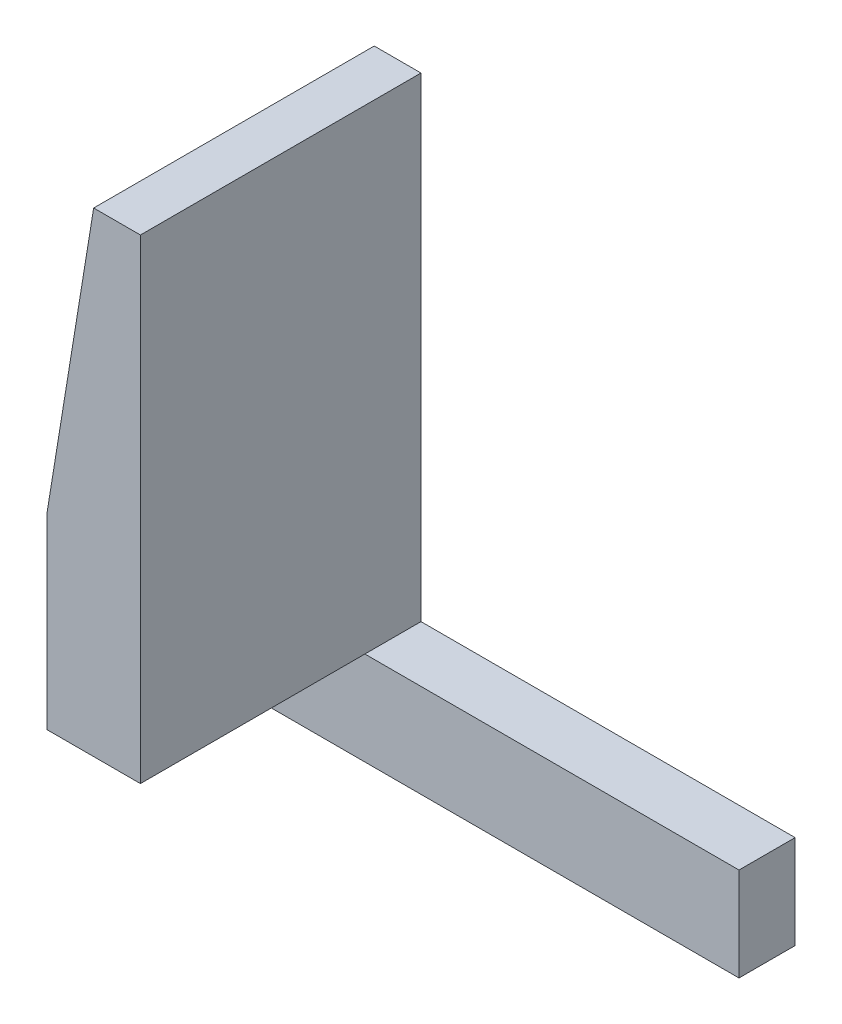
ISO-10303-21;
HEADER;
FILE_DESCRIPTION(('STEP AP214'),'2;1');
FILE_NAME('part.step','',(''),(''),'','','');
FILE_SCHEMA(('AUTOMOTIVE_DESIGN { 1 0 10303 214 1 1 1 1 }'));
ENDSEC;
DATA;
#1=APPLICATION_CONTEXT('core data for automotive mechanical design processes');
#2=APPLICATION_PROTOCOL_DEFINITION('international standard','automotive_design',2000,#1);
#3=PRODUCT_CONTEXT('',#1,'mechanical');
#4=PRODUCT('Part','Part','',(#3));
#5=PRODUCT_RELATED_PRODUCT_CATEGORY('part','',(#4));
#6=PRODUCT_DEFINITION_FORMATION('','',#4);
#7=PRODUCT_DEFINITION_CONTEXT('part definition',#1,'design');
#8=PRODUCT_DEFINITION('design','',#6,#7);
#9=PRODUCT_DEFINITION_SHAPE('','',#8);
#10=(LENGTH_UNIT() NAMED_UNIT(*) SI_UNIT(.MILLI.,.METRE.));
#11=(NAMED_UNIT(*) PLANE_ANGLE_UNIT() SI_UNIT($,.RADIAN.));
#12=(NAMED_UNIT(*) SI_UNIT($,.STERADIAN.) SOLID_ANGLE_UNIT());
#13=UNCERTAINTY_MEASURE_WITH_UNIT(LENGTH_MEASURE(1.E-05),#10,'distance_accuracy_value','');
#14=(GEOMETRIC_REPRESENTATION_CONTEXT(3) GLOBAL_UNCERTAINTY_ASSIGNED_CONTEXT((#13)) GLOBAL_UNIT_ASSIGNED_CONTEXT((#10,
#11,#12)) REPRESENTATION_CONTEXT('',''));
#15=CARTESIAN_POINT('',(0.,0.,0.));
#16=DIRECTION('',(0.,0.,1.));
#17=DIRECTION('',(1.,0.,0.));
#18=AXIS2_PLACEMENT_3D('',#15,#16,#17);
#19=CARTESIAN_POINT('',(-5.,0.,15.));
#20=DIRECTION('',(0.,1.,0.));
#21=DIRECTION('',(0.,0.,1.));
#22=AXIS2_PLACEMENT_3D('',#19,#20,#21);
#23=PLANE('',#22);
#24=DIRECTION('',(-1.,0.,0.));
#25=VECTOR('',#24,1.);
#26=CARTESIAN_POINT('',(-5.,0.,3.));
#27=LINE('',#26,#25);
#28=CARTESIAN_POINT('',(0.,0.,3.));
#29=VERTEX_POINT('',#28);
#30=CARTESIAN_POINT('',(-5.,0.,3.));
#31=VERTEX_POINT('',#30);
#32=EDGE_CURVE('E11',#29,#31,#27,.T.);
#33=ORIENTED_EDGE('',*,*,#32,.F.);
#34=DIRECTION('',(0.,0.,-1.));
#35=VECTOR('',#34,1.);
#36=CARTESIAN_POINT('',(0.,0.,15.));
#37=LINE('',#36,#35);
#38=CARTESIAN_POINT('',(0.,0.,15.));
#39=VERTEX_POINT('',#38);
#40=EDGE_CURVE('E42',#39,#29,#37,.T.);
#41=ORIENTED_EDGE('',*,*,#40,.F.);
#42=DIRECTION('',(1.,0.,0.));
#43=VECTOR('',#42,1.);
#44=CARTESIAN_POINT('',(-5.,0.,15.));
#45=LINE('',#44,#43);
#46=CARTESIAN_POINT('',(-5.,0.,15.));
#47=VERTEX_POINT('',#46);
#48=EDGE_CURVE('E137',#47,#39,#45,.T.);
#49=ORIENTED_EDGE('',*,*,#48,.F.);
#50=DIRECTION('',(0.,0.,-1.));
#51=VECTOR('',#50,1.);
#52=CARTESIAN_POINT('',(-5.,0.,15.));
#53=LINE('',#52,#51);
#54=EDGE_CURVE('E121',#47,#31,#53,.T.);
#55=ORIENTED_EDGE('',*,*,#54,.T.);
#56=EDGE_LOOP('',(#33,#41,#49,#55));
#57=FACE_BOUND('',#56,.T.);
#58=ADVANCED_FACE('F39',(#57),#23,.F.);
#59=CARTESIAN_POINT('',(0.,0.,15.));
#60=DIRECTION('',(-1.,0.,0.));
#61=DIRECTION('',(0.,0.,1.));
#62=AXIS2_PLACEMENT_3D('',#59,#60,#61);
#63=PLANE('',#62);
#64=DIRECTION('',(0.,1.,0.));
#65=VECTOR('',#64,1.);
#66=CARTESIAN_POINT('',(0.,0.,0.));
#67=LINE('',#66,#65);
#68=CARTESIAN_POINT('',(0.,0.,0.));
#69=VERTEX_POINT('',#68);
#70=CARTESIAN_POINT('',(0.,25.4,0.));
#71=VERTEX_POINT('',#70);
#72=EDGE_CURVE('E125',#69,#71,#67,.T.);
#73=ORIENTED_EDGE('',*,*,#72,.T.);
#74=DIRECTION('',(0.,0.,-1.));
#75=VECTOR('',#74,1.);
#76=CARTESIAN_POINT('',(0.,25.4,15.));
#77=LINE('',#76,#75);
#78=CARTESIAN_POINT('',(0.,25.4,15.));
#79=VERTEX_POINT('',#78);
#80=EDGE_CURVE('E114',#79,#71,#77,.T.);
#81=ORIENTED_EDGE('',*,*,#80,.F.);
#82=DIRECTION('',(0.,1.,0.));
#83=VECTOR('',#82,1.);
#84=CARTESIAN_POINT('',(0.,0.,15.));
#85=LINE('',#84,#83);
#86=EDGE_CURVE('E93',#39,#79,#85,.T.);
#87=ORIENTED_EDGE('',*,*,#86,.F.);
#88=ORIENTED_EDGE('',*,*,#40,.T.);
#89=EDGE_CURVE('E142',#29,#69,#37,.T.);
#90=ORIENTED_EDGE('',*,*,#89,.T.);
#91=EDGE_LOOP('',(#73,#81,#87,#88,#90));
#92=FACE_BOUND('',#91,.T.);
#93=ADVANCED_FACE('F147',(#92),#63,.F.);
#94=CARTESIAN_POINT('',(0.,25.4,15.));
#95=DIRECTION('',(0.,-1.,0.));
#96=DIRECTION('',(0.,0.,-1.));
#97=AXIS2_PLACEMENT_3D('',#94,#95,#96);
#98=PLANE('',#97);
#99=DIRECTION('',(-1.,0.,0.));
#100=VECTOR('',#99,1.);
#101=CARTESIAN_POINT('',(0.,25.4,0.));
#102=LINE('',#101,#100);
#103=CARTESIAN_POINT('',(-2.5,25.4,0.));
#104=VERTEX_POINT('',#103);
#105=EDGE_CURVE('E112',#71,#104,#102,.T.);
#106=ORIENTED_EDGE('',*,*,#105,.T.);
#107=DIRECTION('',(0.,0.,-1.));
#108=VECTOR('',#107,1.);
#109=CARTESIAN_POINT('',(-2.5,25.4,15.));
#110=LINE('',#109,#108);
#111=CARTESIAN_POINT('',(-2.5,25.4,15.));
#112=VERTEX_POINT('',#111);
#113=EDGE_CURVE('E109',#112,#104,#110,.T.);
#114=ORIENTED_EDGE('',*,*,#113,.F.);
#115=DIRECTION('',(-1.,0.,0.));
#116=VECTOR('',#115,1.);
#117=CARTESIAN_POINT('',(0.,25.4,15.));
#118=LINE('',#117,#116);
#119=EDGE_CURVE('E100',#79,#112,#118,.T.);
#120=ORIENTED_EDGE('',*,*,#119,.F.);
#121=ORIENTED_EDGE('',*,*,#80,.T.);
#122=EDGE_LOOP('',(#106,#114,#120,#121));
#123=FACE_BOUND('',#122,.T.);
#124=ADVANCED_FACE('F110',(#123),#98,.F.);
#125=CARTESIAN_POINT('',(-2.5,25.4,15.));
#126=DIRECTION('',(0.987078091367104,-0.160239949897257,0.));
#127=DIRECTION('',(0.160239949897257,0.987078091367104,0.));
#128=AXIS2_PLACEMENT_3D('',#125,#126,#127);
#129=PLANE('',#128);
#130=DIRECTION('',(-0.160239949897257,-0.987078091367104,0.));
#131=VECTOR('',#130,1.);
#132=CARTESIAN_POINT('',(-2.5,25.4,0.));
#133=LINE('',#132,#131);
#134=CARTESIAN_POINT('',(-5.,10.,0.));
#135=VERTEX_POINT('',#134);
#136=EDGE_CURVE('E85',#104,#135,#133,.T.);
#137=ORIENTED_EDGE('',*,*,#136,.T.);
#138=DIRECTION('',(0.,0.,-1.));
#139=VECTOR('',#138,1.);
#140=CARTESIAN_POINT('',(-5.,10.,15.));
#141=LINE('',#140,#139);
#142=CARTESIAN_POINT('',(-5.,10.,15.));
#143=VERTEX_POINT('',#142);
#144=EDGE_CURVE('E115',#143,#135,#141,.T.);
#145=ORIENTED_EDGE('',*,*,#144,.F.);
#146=DIRECTION('',(-0.160239949897257,-0.987078091367104,0.));
#147=VECTOR('',#146,1.);
#148=CARTESIAN_POINT('',(-2.5,25.4,15.));
#149=LINE('',#148,#147);
#150=EDGE_CURVE('E104',#112,#143,#149,.T.);
#151=ORIENTED_EDGE('',*,*,#150,.F.);
#152=ORIENTED_EDGE('',*,*,#113,.T.);
#153=EDGE_LOOP('',(#137,#145,#151,#152));
#154=FACE_BOUND('',#153,.T.);
#155=ADVANCED_FACE('F117',(#154),#129,.F.);
#156=CARTESIAN_POINT('',(-5.,10.,15.));
#157=DIRECTION('',(1.,0.,0.));
#158=DIRECTION('',(0.,1.,0.));
#159=AXIS2_PLACEMENT_3D('',#156,#157,#158);
#160=PLANE('',#159);
#161=DIRECTION('',(0.,-1.,0.));
#162=VECTOR('',#161,1.);
#163=CARTESIAN_POINT('',(-5.,10.,0.));
#164=LINE('',#163,#162);
#165=CARTESIAN_POINT('',(-5.,-5.,0.));
#166=VERTEX_POINT('',#165);
#167=EDGE_CURVE('E133',#135,#166,#164,.T.);
#168=ORIENTED_EDGE('',*,*,#167,.T.);
#169=DIRECTION('',(0.,0.,-1.));
#170=VECTOR('',#169,1.);
#171=CARTESIAN_POINT('',(-5.,-5.,0.));
#172=LINE('',#171,#170);
#173=CARTESIAN_POINT('',(-5.,-5.,3.));
#174=VERTEX_POINT('',#173);
#175=EDGE_CURVE('E167',#174,#166,#172,.T.);
#176=ORIENTED_EDGE('',*,*,#175,.F.);
#177=DIRECTION('',(0.,1.,0.));
#178=VECTOR('',#177,1.);
#179=CARTESIAN_POINT('',(-5.,-5.,3.));
#180=LINE('',#179,#178);
#181=EDGE_CURVE('E178',#174,#31,#180,.T.);
#182=ORIENTED_EDGE('',*,*,#181,.T.);
#183=ORIENTED_EDGE('',*,*,#54,.F.);
#184=DIRECTION('',(0.,-1.,0.));
#185=VECTOR('',#184,1.);
#186=CARTESIAN_POINT('',(-5.,10.,15.));
#187=LINE('',#186,#185);
#188=EDGE_CURVE('E63',#143,#47,#187,.T.);
#189=ORIENTED_EDGE('',*,*,#188,.F.);
#190=ORIENTED_EDGE('',*,*,#144,.T.);
#191=EDGE_LOOP('',(#168,#176,#182,#183,#189,#190));
#192=FACE_BOUND('',#191,.T.);
#193=ADVANCED_FACE('F221',(#192),#160,.F.);
#194=CARTESIAN_POINT('',(0.,0.,15.));
#195=DIRECTION('',(0.,0.,1.));
#196=DIRECTION('',(1.,0.,0.));
#197=AXIS2_PLACEMENT_3D('',#194,#195,#196);
#198=PLANE('',#197);
#199=ORIENTED_EDGE('',*,*,#48,.T.);
#200=ORIENTED_EDGE('',*,*,#86,.T.);
#201=ORIENTED_EDGE('',*,*,#119,.T.);
#202=ORIENTED_EDGE('',*,*,#150,.T.);
#203=ORIENTED_EDGE('',*,*,#188,.T.);
#204=EDGE_LOOP('',(#199,#200,#201,#202,#203));
#205=FACE_BOUND('',#204,.T.);
#206=ADVANCED_FACE('F102',(#205),#198,.T.);
#207=CARTESIAN_POINT('',(0.,0.,0.));
#208=DIRECTION('',(0.,0.,1.));
#209=DIRECTION('',(1.,0.,0.));
#210=AXIS2_PLACEMENT_3D('',#207,#208,#209);
#211=PLANE('',#210);
#212=ORIENTED_EDGE('',*,*,#72,.F.);
#213=DIRECTION('',(1.,0.,0.));
#214=VECTOR('',#213,1.);
#215=CARTESIAN_POINT('',(-5.,0.,0.));
#216=LINE('',#215,#214);
#217=CARTESIAN_POINT('',(20.,0.,0.));
#218=VERTEX_POINT('',#217);
#219=EDGE_CURVE('E157',#69,#218,#216,.T.);
#220=ORIENTED_EDGE('',*,*,#219,.T.);
#221=DIRECTION('',(0.,1.,0.));
#222=VECTOR('',#221,1.);
#223=CARTESIAN_POINT('',(20.,-5.,0.));
#224=LINE('',#223,#222);
#225=CARTESIAN_POINT('',(20.,-5.,0.));
#226=VERTEX_POINT('',#225);
#227=EDGE_CURVE('E128',#226,#218,#224,.T.);
#228=ORIENTED_EDGE('',*,*,#227,.F.);
#229=DIRECTION('',(1.,0.,0.));
#230=VECTOR('',#229,1.);
#231=CARTESIAN_POINT('',(-5.,-5.,0.));
#232=LINE('',#231,#230);
#233=EDGE_CURVE('E172',#166,#226,#232,.T.);
#234=ORIENTED_EDGE('',*,*,#233,.F.);
#235=ORIENTED_EDGE('',*,*,#167,.F.);
#236=ORIENTED_EDGE('',*,*,#136,.F.);
#237=ORIENTED_EDGE('',*,*,#105,.F.);
#238=EDGE_LOOP('',(#212,#220,#228,#234,#235,#236,#237));
#239=FACE_BOUND('',#238,.T.);
#240=ADVANCED_FACE('F206',(#239),#211,.F.);
#241=CARTESIAN_POINT('',(0.,0.,0.));
#242=DIRECTION('',(0.,1.,0.));
#243=DIRECTION('',(0.,0.,1.));
#244=AXIS2_PLACEMENT_3D('',#241,#242,#243);
#245=PLANE('',#244);
#246=ORIENTED_EDGE('',*,*,#89,.F.);
#247=CARTESIAN_POINT('',(20.,0.,3.));
#248=VERTEX_POINT('',#247);
#249=EDGE_CURVE('E49',#248,#29,#27,.T.);
#250=ORIENTED_EDGE('',*,*,#249,.F.);
#251=DIRECTION('',(0.,0.,1.));
#252=VECTOR('',#251,1.);
#253=CARTESIAN_POINT('',(20.,0.,0.));
#254=LINE('',#253,#252);
#255=EDGE_CURVE('E168',#218,#248,#254,.T.);
#256=ORIENTED_EDGE('',*,*,#255,.F.);
#257=ORIENTED_EDGE('',*,*,#219,.F.);
#258=EDGE_LOOP('',(#246,#250,#256,#257));
#259=FACE_BOUND('',#258,.T.);
#260=ADVANCED_FACE('F153',(#259),#245,.T.);
#261=CARTESIAN_POINT('',(20.,-5.,0.));
#262=DIRECTION('',(-1.,0.,0.));
#263=DIRECTION('',(0.,0.,1.));
#264=AXIS2_PLACEMENT_3D('',#261,#262,#263);
#265=PLANE('',#264);
#266=ORIENTED_EDGE('',*,*,#255,.T.);
#267=DIRECTION('',(0.,1.,0.));
#268=VECTOR('',#267,1.);
#269=CARTESIAN_POINT('',(20.,-5.,3.));
#270=LINE('',#269,#268);
#271=CARTESIAN_POINT('',(20.,-5.,3.));
#272=VERTEX_POINT('',#271);
#273=EDGE_CURVE('E165',#272,#248,#270,.T.);
#274=ORIENTED_EDGE('',*,*,#273,.F.);
#275=DIRECTION('',(0.,0.,1.));
#276=VECTOR('',#275,1.);
#277=CARTESIAN_POINT('',(20.,-5.,0.));
#278=LINE('',#277,#276);
#279=EDGE_CURVE('E192',#226,#272,#278,.T.);
#280=ORIENTED_EDGE('',*,*,#279,.F.);
#281=ORIENTED_EDGE('',*,*,#227,.T.);
#282=EDGE_LOOP('',(#266,#274,#280,#281));
#283=FACE_BOUND('',#282,.T.);
#284=ADVANCED_FACE('F210',(#283),#265,.F.);
#285=CARTESIAN_POINT('',(-5.,-5.,3.));
#286=DIRECTION('',(0.,0.,-1.));
#287=DIRECTION('',(-1.,0.,0.));
#288=AXIS2_PLACEMENT_3D('',#285,#286,#287);
#289=PLANE('',#288);
#290=ORIENTED_EDGE('',*,*,#249,.T.);
#291=ORIENTED_EDGE('',*,*,#32,.T.);
#292=ORIENTED_EDGE('',*,*,#181,.F.);
#293=DIRECTION('',(-1.,0.,0.));
#294=VECTOR('',#293,1.);
#295=CARTESIAN_POINT('',(-5.,-5.,3.));
#296=LINE('',#295,#294);
#297=EDGE_CURVE('E181',#272,#174,#296,.T.);
#298=ORIENTED_EDGE('',*,*,#297,.F.);
#299=ORIENTED_EDGE('',*,*,#273,.T.);
#300=EDGE_LOOP('',(#290,#291,#292,#298,#299));
#301=FACE_BOUND('',#300,.T.);
#302=ADVANCED_FACE('F160',(#301),#289,.F.);
#303=CARTESIAN_POINT('',(0.,-5.,0.));
#304=DIRECTION('',(0.,1.,0.));
#305=DIRECTION('',(0.,0.,1.));
#306=AXIS2_PLACEMENT_3D('',#303,#304,#305);
#307=PLANE('',#306);
#308=ORIENTED_EDGE('',*,*,#175,.T.);
#309=ORIENTED_EDGE('',*,*,#233,.T.);
#310=ORIENTED_EDGE('',*,*,#279,.T.);
#311=ORIENTED_EDGE('',*,*,#297,.T.);
#312=EDGE_LOOP('',(#308,#309,#310,#311));
#313=FACE_BOUND('',#312,.T.);
#314=ADVANCED_FACE('F214',(#313),#307,.F.);
#315=CLOSED_SHELL('',(#58,#93,#124,#155,#193,#206,#240,#260,#284,#302,#314));
#316=MANIFOLD_SOLID_BREP('B2',#315);
#317=ADVANCED_BREP_SHAPE_REPRESENTATION('',(#18,#316),#14);
#318=SHAPE_DEFINITION_REPRESENTATION(#9,#317);
ENDSEC;
END-ISO-10303-21;
